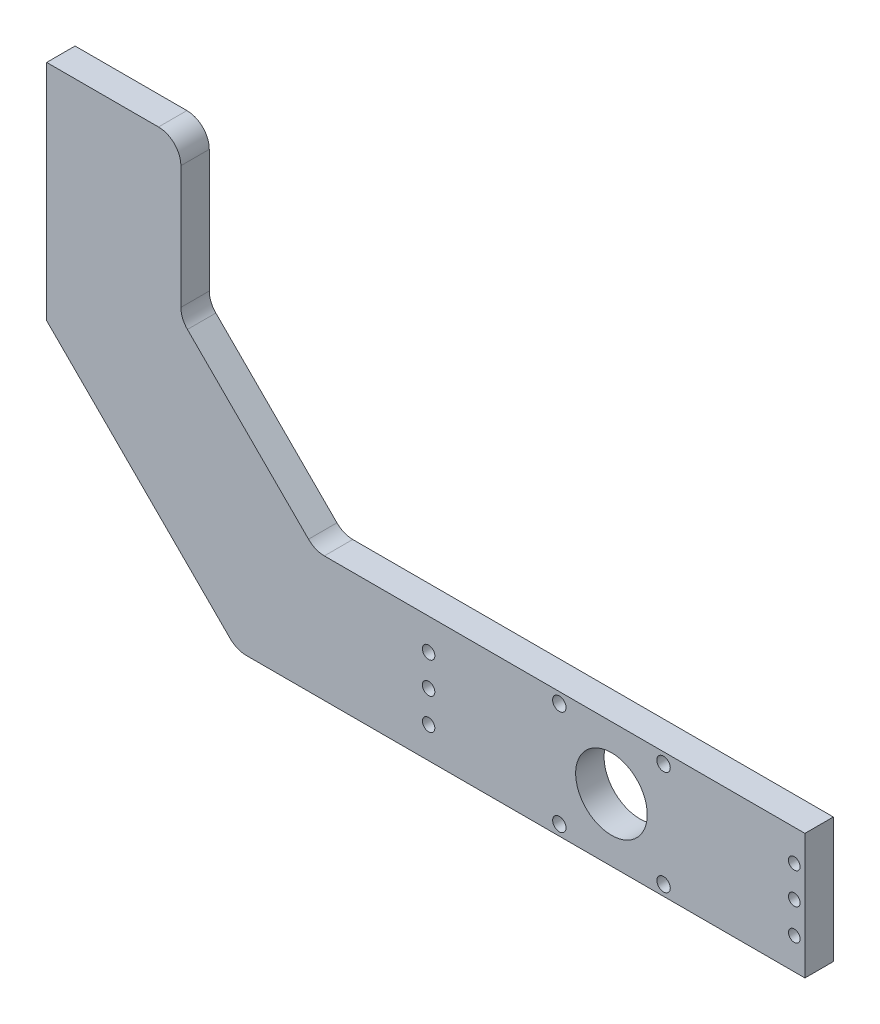
ISO-10303-21;
HEADER;
FILE_DESCRIPTION(('STEP AP214'),'2;1');
FILE_NAME('part.step','',(''),(''),'','','');
FILE_SCHEMA(('AUTOMOTIVE_DESIGN { 1 0 10303 214 1 1 1 1 }'));
ENDSEC;
DATA;
#1=APPLICATION_CONTEXT('core data for automotive mechanical design processes');
#2=APPLICATION_PROTOCOL_DEFINITION('international standard','automotive_design',2000,#1);
#3=PRODUCT_CONTEXT('',#1,'mechanical');
#4=PRODUCT('Part','Part','',(#3));
#5=PRODUCT_RELATED_PRODUCT_CATEGORY('part','',(#4));
#6=PRODUCT_DEFINITION_FORMATION('','',#4);
#7=PRODUCT_DEFINITION_CONTEXT('part definition',#1,'design');
#8=PRODUCT_DEFINITION('design','',#6,#7);
#9=PRODUCT_DEFINITION_SHAPE('','',#8);
#10=(LENGTH_UNIT() NAMED_UNIT(*) SI_UNIT(.MILLI.,.METRE.));
#11=(NAMED_UNIT(*) PLANE_ANGLE_UNIT() SI_UNIT($,.RADIAN.));
#12=(NAMED_UNIT(*) SI_UNIT($,.STERADIAN.) SOLID_ANGLE_UNIT());
#13=UNCERTAINTY_MEASURE_WITH_UNIT(LENGTH_MEASURE(1.E-05),#10,'distance_accuracy_value','');
#14=(GEOMETRIC_REPRESENTATION_CONTEXT(3) GLOBAL_UNCERTAINTY_ASSIGNED_CONTEXT((#13)) GLOBAL_UNIT_ASSIGNED_CONTEXT((#10,
#11,#12)) REPRESENTATION_CONTEXT('',''));
#15=CARTESIAN_POINT('',(0.,0.,0.));
#16=DIRECTION('',(0.,0.,1.));
#17=DIRECTION('',(1.,0.,0.));
#18=AXIS2_PLACEMENT_3D('',#15,#16,#17);
#19=CARTESIAN_POINT('',(18.4222454265081,-36.0239718131346,12.7));
#20=DIRECTION('',(0.,-1.,0.));
#21=DIRECTION('',(1.,0.,0.));
#22=AXIS2_PLACEMENT_3D('',#19,#20,#21);
#23=PLANE('',#22);
#24=DIRECTION('',(-1.,0.,0.));
#25=VECTOR('',#24,1.);
#26=CARTESIAN_POINT('',(18.4222454265081,-36.0239718131346,0.));
#27=LINE('',#26,#25);
#28=CARTESIAN_POINT('',(224.714042280299,-36.0239718131344,0.));
#29=VERTEX_POINT('',#28);
#30=CARTESIAN_POINT('',(9.85617790402943,-36.0239718131346,0.));
#31=VERTEX_POINT('',#30);
#32=EDGE_CURVE('E161',#29,#31,#27,.T.);
#33=ORIENTED_EDGE('',*,*,#32,.T.);
#34=DIRECTION('',(0.,0.,-1.));
#35=VECTOR('',#34,1.);
#36=CARTESIAN_POINT('',(9.85617790402943,-36.0239718131346,12.7));
#37=LINE('',#36,#35);
#38=CARTESIAN_POINT('',(9.85617790402943,-36.0239718131346,12.7));
#39=VERTEX_POINT('',#38);
#40=EDGE_CURVE('E196',#31,#39,#37,.F.);
#41=ORIENTED_EDGE('',*,*,#40,.T.);
#42=DIRECTION('',(-1.,0.,0.));
#43=VECTOR('',#42,1.);
#44=CARTESIAN_POINT('',(18.4222454265081,-36.0239718131346,12.7));
#45=LINE('',#44,#43);
#46=CARTESIAN_POINT('',(224.714042280299,-36.0239718131344,12.7));
#47=VERTEX_POINT('',#46);
#48=EDGE_CURVE('E178',#47,#39,#45,.T.);
#49=ORIENTED_EDGE('',*,*,#48,.F.);
#50=DIRECTION('',(0.,0.,-1.));
#51=VECTOR('',#50,1.);
#52=CARTESIAN_POINT('',(224.714042280299,-36.0239718131344,12.7));
#53=LINE('',#52,#51);
#54=EDGE_CURVE('E160',#47,#29,#53,.T.);
#55=ORIENTED_EDGE('',*,*,#54,.T.);
#56=EDGE_LOOP('',(#33,#41,#49,#55));
#57=FACE_BOUND('',#56,.T.);
#58=ADVANCED_FACE('F34',(#57),#23,.F.);
#59=CARTESIAN_POINT('',(201.815385528004,-232.125315060842,12.7));
#60=DIRECTION('',(-0.707106781186551,-0.707106781186544,0.));
#61=DIRECTION('',(0.707106781186544,-0.707106781186551,0.));
#62=AXIS2_PLACEMENT_3D('',#59,#60,#61);
#63=PLANE('',#62);
#64=DIRECTION('',(-0.707106781186544,0.707106781186551,0.));
#65=VECTOR('',#64,1.);
#66=CARTESIAN_POINT('',(201.815385528004,-232.125315060842,0.));
#67=LINE('',#66,#65);
#68=CARTESIAN_POINT('',(2.78511009216389,-33.095039625,0.));
#69=VERTEX_POINT('',#68);
#70=CARTESIAN_POINT('',(-51.3570255315668,21.0470959987312,0.));
#71=VERTEX_POINT('',#70);
#72=EDGE_CURVE('E164',#69,#71,#67,.T.);
#73=ORIENTED_EDGE('',*,*,#72,.T.);
#74=DIRECTION('',(0.,0.,-1.));
#75=VECTOR('',#74,1.);
#76=CARTESIAN_POINT('',(-51.3570255315667,21.0470959987312,12.7));
#77=LINE('',#76,#75);
#78=CARTESIAN_POINT('',(-51.3570255315668,21.0470959987312,12.7));
#79=VERTEX_POINT('',#78);
#80=EDGE_CURVE('E194',#71,#79,#77,.F.);
#81=ORIENTED_EDGE('',*,*,#80,.T.);
#82=DIRECTION('',(-0.707106781186544,0.707106781186551,0.));
#83=VECTOR('',#82,1.);
#84=CARTESIAN_POINT('',(201.815385528004,-232.125315060842,12.7));
#85=LINE('',#84,#83);
#86=CARTESIAN_POINT('',(2.78511009216389,-33.095039625,12.7));
#87=VERTEX_POINT('',#86);
#88=EDGE_CURVE('E228',#87,#79,#85,.T.);
#89=ORIENTED_EDGE('',*,*,#88,.F.);
#90=DIRECTION('',(0.,0.,-1.));
#91=VECTOR('',#90,1.);
#92=CARTESIAN_POINT('',(2.78511009216391,-33.095039625,0.));
#93=LINE('',#92,#91);
#94=EDGE_CURVE('E191',#87,#69,#93,.T.);
#95=ORIENTED_EDGE('',*,*,#94,.T.);
#96=EDGE_LOOP('',(#73,#81,#89,#95));
#97=FACE_BOUND('',#96,.T.);
#98=ADVANCED_FACE('F231',(#97),#63,.F.);
#99=CARTESIAN_POINT('',(-54.2859577197013,-415.518455162336,12.7));
#100=DIRECTION('',(1.,0.,0.));
#101=DIRECTION('',(0.,1.,0.));
#102=AXIS2_PLACEMENT_3D('',#99,#100,#101);
#103=PLANE('',#102);
#104=DIRECTION('',(0.,-1.,0.));
#105=VECTOR('',#104,1.);
#106=CARTESIAN_POINT('',(-54.2859577197013,-415.518455162336,12.7));
#107=LINE('',#106,#105);
#108=CARTESIAN_POINT('',(-54.2859577197012,82.9760281868658,12.7));
#109=VERTEX_POINT('',#108);
#110=CARTESIAN_POINT('',(-54.2859577197012,28.1181638105967,12.7));
#111=VERTEX_POINT('',#110);
#112=EDGE_CURVE('E155',#109,#111,#107,.T.);
#113=ORIENTED_EDGE('',*,*,#112,.T.);
#114=DIRECTION('',(0.,0.,-1.));
#115=VECTOR('',#114,1.);
#116=CARTESIAN_POINT('',(-54.2859577197012,28.1181638105967,12.7));
#117=LINE('',#116,#115);
#118=CARTESIAN_POINT('',(-54.2859577197012,28.1181638105967,0.));
#119=VERTEX_POINT('',#118);
#120=EDGE_CURVE('E188',#111,#119,#117,.T.);
#121=ORIENTED_EDGE('',*,*,#120,.T.);
#122=DIRECTION('',(0.,-1.,0.));
#123=VECTOR('',#122,1.);
#124=CARTESIAN_POINT('',(-54.2859577197013,-415.518455162336,0.));
#125=LINE('',#124,#123);
#126=CARTESIAN_POINT('',(-54.2859577197012,82.9760281868658,0.));
#127=VERTEX_POINT('',#126);
#128=EDGE_CURVE('E168',#127,#119,#125,.T.);
#129=ORIENTED_EDGE('',*,*,#128,.F.);
#130=DIRECTION('',(0.,0.,-1.));
#131=VECTOR('',#130,1.);
#132=CARTESIAN_POINT('',(-54.2859577197012,82.9760281868658,12.7));
#133=LINE('',#132,#131);
#134=EDGE_CURVE('E186',#127,#109,#133,.F.);
#135=ORIENTED_EDGE('',*,*,#134,.T.);
#136=EDGE_LOOP('',(#113,#121,#129,#135));
#137=FACE_BOUND('',#136,.T.);
#138=ADVANCED_FACE('F375',(#137),#103,.T.);
#139=CARTESIAN_POINT('',(18.4222454265051,92.9760281868663,12.7));
#140=DIRECTION('',(0.,-1.,0.));
#141=DIRECTION('',(1.,0.,0.));
#142=AXIS2_PLACEMENT_3D('',#139,#140,#141);
#143=PLANE('',#142);
#144=DIRECTION('',(-1.,0.,0.));
#145=VECTOR('',#144,1.);
#146=CARTESIAN_POINT('',(18.4222454265051,92.9760281868663,12.7));
#147=LINE('',#146,#145);
#148=CARTESIAN_POINT('',(-64.2859577197013,92.9760281868658,12.7));
#149=VERTEX_POINT('',#148);
#150=CARTESIAN_POINT('',(-114.285957719702,92.9760281868655,12.7));
#151=VERTEX_POINT('',#150);
#152=EDGE_CURVE('E149',#149,#151,#147,.T.);
#153=ORIENTED_EDGE('',*,*,#152,.F.);
#154=DIRECTION('',(0.,0.,-1.));
#155=VECTOR('',#154,1.);
#156=CARTESIAN_POINT('',(-64.2859577197013,92.9760281868658,0.));
#157=LINE('',#156,#155);
#158=CARTESIAN_POINT('',(-64.2859577197013,92.9760281868658,0.));
#159=VERTEX_POINT('',#158);
#160=EDGE_CURVE('E207',#149,#159,#157,.T.);
#161=ORIENTED_EDGE('',*,*,#160,.T.);
#162=DIRECTION('',(-1.,0.,0.));
#163=VECTOR('',#162,1.);
#164=CARTESIAN_POINT('',(18.4222454265051,92.9760281868663,0.));
#165=LINE('',#164,#163);
#166=CARTESIAN_POINT('',(-114.285957719702,92.9760281868655,0.));
#167=VERTEX_POINT('',#166);
#168=EDGE_CURVE('E171',#159,#167,#165,.T.);
#169=ORIENTED_EDGE('',*,*,#168,.T.);
#170=DIRECTION('',(0.,0.,-1.));
#171=VECTOR('',#170,1.);
#172=CARTESIAN_POINT('',(-114.285957719702,92.9760281868655,12.7));
#173=LINE('',#172,#171);
#174=EDGE_CURVE('E184',#151,#167,#173,.T.);
#175=ORIENTED_EDGE('',*,*,#174,.F.);
#176=EDGE_LOOP('',(#153,#161,#169,#175));
#177=FACE_BOUND('',#176,.T.);
#178=ADVANCED_FACE('F404',(#177),#143,.F.);
#179=CARTESIAN_POINT('',(-114.285957719701,-415.518455162336,12.7));
#180=DIRECTION('',(1.,0.,0.));
#181=DIRECTION('',(0.,1.,0.));
#182=AXIS2_PLACEMENT_3D('',#179,#180,#181);
#183=PLANE('',#182);
#184=CARTESIAN_POINT('',(-114.285957719702,17.976028186866,4.76500000000001));
#185=DIRECTION('',(-1.,0.,0.));
#186=DIRECTION('',(0.,-1.,0.));
#187=AXIS2_PLACEMENT_3D('',#184,#185,#186);
#188=CIRCLE('',#187,2.5);
#189=CARTESIAN_POINT('',(-114.285957719702,15.476028186866,4.76500000000001));
#190=VERTEX_POINT('',#189);
#191=EDGE_CURVE('E279',#190,#190,#188,.T.);
#192=ORIENTED_EDGE('',*,*,#191,.F.);
#193=EDGE_LOOP('',(#192));
#194=FACE_BOUND('',#193,.T.);
#195=CARTESIAN_POINT('',(-114.285957719702,42.9760281868658,4.76500000000001));
#196=DIRECTION('',(-1.,0.,0.));
#197=DIRECTION('',(0.,-1.,0.));
#198=AXIS2_PLACEMENT_3D('',#195,#196,#197);
#199=CIRCLE('',#198,2.5);
#200=CARTESIAN_POINT('',(-114.285957719702,40.4760281868658,4.76500000000001));
#201=VERTEX_POINT('',#200);
#202=EDGE_CURVE('E273',#201,#201,#199,.T.);
#203=ORIENTED_EDGE('',*,*,#202,.F.);
#204=EDGE_LOOP('',(#203));
#205=FACE_BOUND('',#204,.T.);
#206=CARTESIAN_POINT('',(-114.285957719702,67.9760281868655,4.765));
#207=DIRECTION('',(-1.,0.,0.));
#208=DIRECTION('',(0.,-1.,0.));
#209=AXIS2_PLACEMENT_3D('',#206,#207,#208);
#210=CIRCLE('',#209,2.5);
#211=CARTESIAN_POINT('',(-114.285957719702,65.4760281868655,4.765));
#212=VERTEX_POINT('',#211);
#213=EDGE_CURVE('E267',#212,#212,#210,.T.);
#214=ORIENTED_EDGE('',*,*,#213,.F.);
#215=EDGE_LOOP('',(#214));
#216=FACE_BOUND('',#215,.T.);
#217=DIRECTION('',(0.,-1.,0.));
#218=VECTOR('',#217,1.);
#219=CARTESIAN_POINT('',(-114.285957719701,-415.518455162336,0.));
#220=LINE('',#219,#218);
#221=CARTESIAN_POINT('',(-114.285957719702,-7.02397181313455,0.));
#222=VERTEX_POINT('',#221);
#223=EDGE_CURVE('E143',#167,#222,#220,.T.);
#224=ORIENTED_EDGE('',*,*,#223,.T.);
#225=DIRECTION('',(0.,0.,1.));
#226=VECTOR('',#225,1.);
#227=CARTESIAN_POINT('',(-114.285957719702,-7.02397181313451,-0.000999999999999265));
#228=LINE('',#227,#226);
#229=CARTESIAN_POINT('',(-114.285957719702,-7.02397181313451,12.7));
#230=VERTEX_POINT('',#229);
#231=EDGE_CURVE('E128',#222,#230,#228,.T.);
#232=ORIENTED_EDGE('',*,*,#231,.T.);
#233=DIRECTION('',(0.,-1.,0.));
#234=VECTOR('',#233,1.);
#235=CARTESIAN_POINT('',(-114.285957719701,-415.518455162336,12.7));
#236=LINE('',#235,#234);
#237=EDGE_CURVE('E141',#151,#230,#236,.T.);
#238=ORIENTED_EDGE('',*,*,#237,.F.);
#239=ORIENTED_EDGE('',*,*,#174,.T.);
#240=EDGE_LOOP('',(#224,#232,#238,#239));
#241=FACE_BOUND('',#240,.T.);
#242=ADVANCED_FACE('F139',(#194,#205,#216,#241),#183,.F.);
#243=CARTESIAN_POINT('',(18.4222454265082,-92.0239718131345,12.7));
#244=DIRECTION('',(0.,1.,0.));
#245=DIRECTION('',(0.,0.,1.));
#246=AXIS2_PLACEMENT_3D('',#243,#244,#245);
#247=PLANE('',#246);
#248=DIRECTION('',(1.,0.,0.));
#249=VECTOR('',#248,1.);
#250=CARTESIAN_POINT('',(18.4222454265082,-92.0239718131345,12.7));
#251=LINE('',#250,#249);
#252=CARTESIAN_POINT('',(-25.1438220959715,-92.0239718131345,12.7));
#253=VERTEX_POINT('',#252);
#254=CARTESIAN_POINT('',(224.714042280298,-92.0239718131345,12.7));
#255=VERTEX_POINT('',#254);
#256=EDGE_CURVE('E151',#253,#255,#251,.T.);
#257=ORIENTED_EDGE('',*,*,#256,.F.);
#258=DIRECTION('',(0.,0.,1.));
#259=VECTOR('',#258,1.);
#260=CARTESIAN_POINT('',(-25.1438220959715,-92.0239718131345,12.7));
#261=LINE('',#260,#259);
#262=CARTESIAN_POINT('',(-25.1438220959715,-92.0239718131345,0.));
#263=VERTEX_POINT('',#262);
#264=EDGE_CURVE('E57',#253,#263,#261,.F.);
#265=ORIENTED_EDGE('',*,*,#264,.T.);
#266=DIRECTION('',(1.,0.,0.));
#267=VECTOR('',#266,1.);
#268=CARTESIAN_POINT('',(18.4222454265082,-92.0239718131345,0.));
#269=LINE('',#268,#267);
#270=CARTESIAN_POINT('',(224.714042280298,-92.0239718131345,0.));
#271=VERTEX_POINT('',#270);
#272=EDGE_CURVE('E174',#263,#271,#269,.T.);
#273=ORIENTED_EDGE('',*,*,#272,.T.);
#274=DIRECTION('',(0.,0.,-1.));
#275=VECTOR('',#274,1.);
#276=CARTESIAN_POINT('',(224.714042280298,-92.0239718131345,12.7));
#277=LINE('',#276,#275);
#278=EDGE_CURVE('E181',#255,#271,#277,.T.);
#279=ORIENTED_EDGE('',*,*,#278,.F.);
#280=EDGE_LOOP('',(#257,#265,#273,#279));
#281=FACE_BOUND('',#280,.T.);
#282=ADVANCED_FACE('F392',(#281),#247,.F.);
#283=CARTESIAN_POINT('',(224.714042280299,-415.518455162336,12.7));
#284=DIRECTION('',(-1.,0.,0.));
#285=DIRECTION('',(0.,0.,1.));
#286=AXIS2_PLACEMENT_3D('',#283,#284,#285);
#287=PLANE('',#286);
#288=DIRECTION('',(0.,1.,0.));
#289=VECTOR('',#288,1.);
#290=CARTESIAN_POINT('',(224.714042280299,-415.518455162336,0.));
#291=LINE('',#290,#289);
#292=EDGE_CURVE('E176',#271,#29,#291,.T.);
#293=ORIENTED_EDGE('',*,*,#292,.T.);
#294=ORIENTED_EDGE('',*,*,#54,.F.);
#295=DIRECTION('',(0.,1.,0.));
#296=VECTOR('',#295,1.);
#297=CARTESIAN_POINT('',(224.714042280299,-415.518455162336,12.7));
#298=LINE('',#297,#296);
#299=EDGE_CURVE('E153',#255,#47,#298,.T.);
#300=ORIENTED_EDGE('',*,*,#299,.F.);
#301=ORIENTED_EDGE('',*,*,#278,.T.);
#302=EDGE_LOOP('',(#293,#294,#300,#301));
#303=FACE_BOUND('',#302,.T.);
#304=ADVANCED_FACE('F326',(#303),#287,.F.);
#305=CARTESIAN_POINT('',(18.4222454265082,-415.518455162336,12.7));
#306=DIRECTION('',(0.,0.,1.));
#307=DIRECTION('',(1.,0.,0.));
#308=AXIS2_PLACEMENT_3D('',#305,#306,#307);
#309=PLANE('',#308);
#310=CARTESIAN_POINT('',(219.954042280298,-78.0239718131345,12.7));
#311=DIRECTION('',(0.,0.,1.));
#312=DIRECTION('',(1.,0.,0.));
#313=AXIS2_PLACEMENT_3D('',#310,#311,#312);
#314=CIRCLE('',#313,2.59999999999999);
#315=CARTESIAN_POINT('',(222.554042280298,-78.0239718131345,12.7));
#316=VERTEX_POINT('',#315);
#317=EDGE_CURVE('E317',#316,#316,#314,.T.);
#318=ORIENTED_EDGE('',*,*,#317,.F.);
#319=EDGE_LOOP('',(#318));
#320=FACE_BOUND('',#319,.T.);
#321=CARTESIAN_POINT('',(219.954042280298,-64.0239718131345,12.7));
#322=DIRECTION('',(0.,0.,1.));
#323=DIRECTION('',(1.,0.,0.));
#324=AXIS2_PLACEMENT_3D('',#321,#322,#323);
#325=CIRCLE('',#324,2.59999999999999);
#326=CARTESIAN_POINT('',(222.554042280298,-64.0239718131345,12.7));
#327=VERTEX_POINT('',#326);
#328=EDGE_CURVE('E311',#327,#327,#325,.T.);
#329=ORIENTED_EDGE('',*,*,#328,.F.);
#330=EDGE_LOOP('',(#329));
#331=FACE_BOUND('',#330,.T.);
#332=CARTESIAN_POINT('',(219.954042280298,-50.0239718131344,12.7));
#333=DIRECTION('',(0.,0.,1.));
#334=DIRECTION('',(1.,0.,0.));
#335=AXIS2_PLACEMENT_3D('',#332,#333,#334);
#336=CIRCLE('',#335,2.59999999999999);
#337=CARTESIAN_POINT('',(222.554042280298,-50.0239718131344,12.7));
#338=VERTEX_POINT('',#337);
#339=EDGE_CURVE('E305',#338,#338,#336,.T.);
#340=ORIENTED_EDGE('',*,*,#339,.F.);
#341=EDGE_LOOP('',(#340));
#342=FACE_BOUND('',#341,.T.);
#343=CARTESIAN_POINT('',(56.4740422802985,-78.0239718131356,12.7));
#344=DIRECTION('',(0.,0.,1.));
#345=DIRECTION('',(1.,0.,0.));
#346=AXIS2_PLACEMENT_3D('',#343,#344,#345);
#347=CIRCLE('',#346,2.78);
#348=CARTESIAN_POINT('',(59.2540422802984,-78.0239718131356,12.7));
#349=VERTEX_POINT('',#348);
#350=EDGE_CURVE('E299',#349,#349,#347,.T.);
#351=ORIENTED_EDGE('',*,*,#350,.F.);
#352=EDGE_LOOP('',(#351));
#353=FACE_BOUND('',#352,.T.);
#354=CARTESIAN_POINT('',(56.4740422802985,-64.0239718131355,12.7));
#355=DIRECTION('',(0.,0.,1.));
#356=DIRECTION('',(1.,0.,0.));
#357=AXIS2_PLACEMENT_3D('',#354,#355,#356);
#358=CIRCLE('',#357,2.78);
#359=CARTESIAN_POINT('',(59.2540422802984,-64.0239718131355,12.7));
#360=VERTEX_POINT('',#359);
#361=EDGE_CURVE('E293',#360,#360,#358,.T.);
#362=ORIENTED_EDGE('',*,*,#361,.F.);
#363=EDGE_LOOP('',(#362));
#364=FACE_BOUND('',#363,.T.);
#365=CARTESIAN_POINT('',(56.4740422802984,-50.0239718131353,12.7));
#366=DIRECTION('',(0.,0.,1.));
#367=DIRECTION('',(1.,0.,0.));
#368=AXIS2_PLACEMENT_3D('',#365,#366,#367);
#369=CIRCLE('',#368,2.78);
#370=CARTESIAN_POINT('',(59.2540422802984,-50.0239718131353,12.7));
#371=VERTEX_POINT('',#370);
#372=EDGE_CURVE('E287',#371,#371,#369,.T.);
#373=ORIENTED_EDGE('',*,*,#372,.F.);
#374=EDGE_LOOP('',(#373));
#375=FACE_BOUND('',#374,.T.);
#376=DIRECTION('',(-0.707106781186544,0.707106781186551,0.));
#377=VECTOR('',#376,1.);
#378=CARTESIAN_POINT('',(-29.2859577197025,-92.0239718131345,12.7));
#379=LINE('',#378,#377);
#380=CARTESIAN_POINT('',(-32.214889907837,-89.0950396249999,12.7));
#381=VERTEX_POINT('',#380);
#382=EDGE_CURVE('E124',#381,#230,#379,.T.);
#383=ORIENTED_EDGE('',*,*,#382,.F.);
#384=CARTESIAN_POINT('',(-25.1438220959715,-82.0239718131345,12.7));
#385=DIRECTION('',(0.,0.,1.));
#386=DIRECTION('',(1.,0.,0.));
#387=AXIS2_PLACEMENT_3D('',#384,#385,#386);
#388=CIRCLE('',#387,10.);
#389=EDGE_CURVE('E201',#381,#253,#388,.T.);
#390=ORIENTED_EDGE('',*,*,#389,.T.);
#391=ORIENTED_EDGE('',*,*,#256,.T.);
#392=ORIENTED_EDGE('',*,*,#299,.T.);
#393=ORIENTED_EDGE('',*,*,#48,.T.);
#394=CARTESIAN_POINT('',(9.85617790402943,-26.0239718131345,12.7));
#395=DIRECTION('',(0.,0.,1.));
#396=DIRECTION('',(1.,0.,0.));
#397=AXIS2_PLACEMENT_3D('',#394,#395,#396);
#398=CIRCLE('',#397,10.);
#399=EDGE_CURVE('E11',#39,#87,#398,.F.);
#400=ORIENTED_EDGE('',*,*,#399,.T.);
#401=ORIENTED_EDGE('',*,*,#88,.T.);
#402=CARTESIAN_POINT('',(-44.2859577197012,28.1181638105967,12.7));
#403=DIRECTION('',(0.,0.,1.));
#404=DIRECTION('',(1.,0.,0.));
#405=AXIS2_PLACEMENT_3D('',#402,#403,#404);
#406=CIRCLE('',#405,10.);
#407=EDGE_CURVE('E211',#79,#111,#406,.F.);
#408=ORIENTED_EDGE('',*,*,#407,.T.);
#409=ORIENTED_EDGE('',*,*,#112,.F.);
#410=CARTESIAN_POINT('',(-64.2859577197012,82.9760281868658,12.7));
#411=DIRECTION('',(0.,0.,1.));
#412=DIRECTION('',(1.,0.,0.));
#413=AXIS2_PLACEMENT_3D('',#410,#411,#412);
#414=CIRCLE('',#413,10.);
#415=EDGE_CURVE('E199',#109,#149,#414,.T.);
#416=ORIENTED_EDGE('',*,*,#415,.T.);
#417=ORIENTED_EDGE('',*,*,#152,.T.);
#418=ORIENTED_EDGE('',*,*,#237,.T.);
#419=EDGE_LOOP('',(#383,#390,#391,#392,#393,#400,#401,#408,#409,#416,#417,#418));
#420=FACE_BOUND('',#419,.T.);
#421=CARTESIAN_POINT('',(114.914042280298,-87.3239718131345,12.7));
#422=DIRECTION('',(0.,0.,1.));
#423=DIRECTION('',(-1.,0.,0.));
#424=AXIS2_PLACEMENT_3D('',#421,#422,#423);
#425=CIRCLE('',#424,3.00000000000001);
#426=CARTESIAN_POINT('',(111.914042280298,-87.3239718131345,12.7));
#427=VERTEX_POINT('',#426);
#428=EDGE_CURVE('E263',#427,#427,#425,.T.);
#429=ORIENTED_EDGE('',*,*,#428,.F.);
#430=EDGE_LOOP('',(#429));
#431=FACE_BOUND('',#430,.T.);
#432=CARTESIAN_POINT('',(161.514042280298,-87.3239718131345,12.7));
#433=DIRECTION('',(0.,0.,1.));
#434=DIRECTION('',(1.,0.,0.));
#435=AXIS2_PLACEMENT_3D('',#432,#433,#434);
#436=CIRCLE('',#435,2.99999999999999);
#437=CARTESIAN_POINT('',(164.514042280298,-87.3239718131345,12.7));
#438=VERTEX_POINT('',#437);
#439=EDGE_CURVE('E257',#438,#438,#436,.T.);
#440=ORIENTED_EDGE('',*,*,#439,.F.);
#441=EDGE_LOOP('',(#440));
#442=FACE_BOUND('',#441,.T.);
#443=CARTESIAN_POINT('',(161.514042280298,-40.7239718131345,12.7));
#444=DIRECTION('',(0.,0.,1.));
#445=DIRECTION('',(-1.,0.,0.));
#446=AXIS2_PLACEMENT_3D('',#443,#444,#445);
#447=CIRCLE('',#446,2.99999999999999);
#448=CARTESIAN_POINT('',(158.514042280298,-40.7239718131345,12.7));
#449=VERTEX_POINT('',#448);
#450=EDGE_CURVE('E251',#449,#449,#447,.T.);
#451=ORIENTED_EDGE('',*,*,#450,.F.);
#452=EDGE_LOOP('',(#451));
#453=FACE_BOUND('',#452,.T.);
#454=CARTESIAN_POINT('',(114.914042280298,-40.7239718131345,12.7));
#455=DIRECTION('',(0.,0.,1.));
#456=DIRECTION('',(1.,0.,0.));
#457=AXIS2_PLACEMENT_3D('',#454,#455,#456);
#458=CIRCLE('',#457,3.00000000000001);
#459=CARTESIAN_POINT('',(117.914042280298,-40.7239718131345,12.7));
#460=VERTEX_POINT('',#459);
#461=EDGE_CURVE('E245',#460,#460,#458,.T.);
#462=ORIENTED_EDGE('',*,*,#461,.F.);
#463=EDGE_LOOP('',(#462));
#464=FACE_BOUND('',#463,.T.);
#465=CARTESIAN_POINT('',(138.214042280298,-64.0239718131345,12.7));
#466=DIRECTION('',(0.,0.,1.));
#467=DIRECTION('',(1.,0.,0.));
#468=AXIS2_PLACEMENT_3D('',#465,#466,#467);
#469=CIRCLE('',#468,16.);
#470=CARTESIAN_POINT('',(154.214042280298,-64.0239718131345,12.7));
#471=VERTEX_POINT('',#470);
#472=EDGE_CURVE('E239',#471,#471,#469,.T.);
#473=ORIENTED_EDGE('',*,*,#472,.F.);
#474=EDGE_LOOP('',(#473));
#475=FACE_BOUND('',#474,.T.);
#476=ADVANCED_FACE('F146',(#320,#331,#342,#353,#364,#375,#420,#431,#442,#453,#464,#475),#309,.T.);
#477=CARTESIAN_POINT('',(18.4222454265082,-415.518455162336,0.));
#478=DIRECTION('',(0.,0.,1.));
#479=DIRECTION('',(1.,0.,0.));
#480=AXIS2_PLACEMENT_3D('',#477,#478,#479);
#481=PLANE('',#480);
#482=CARTESIAN_POINT('',(219.954042280298,-78.0239718131345,0.));
#483=DIRECTION('',(0.,0.,1.));
#484=DIRECTION('',(1.,0.,0.));
#485=AXIS2_PLACEMENT_3D('',#482,#483,#484);
#486=CIRCLE('',#485,2.59999999999999);
#487=CARTESIAN_POINT('',(222.554042280298,-78.0239718131345,0.));
#488=VERTEX_POINT('',#487);
#489=EDGE_CURVE('E314',#488,#488,#486,.F.);
#490=ORIENTED_EDGE('',*,*,#489,.F.);
#491=EDGE_LOOP('',(#490));
#492=FACE_BOUND('',#491,.T.);
#493=CARTESIAN_POINT('',(219.954042280298,-64.0239718131345,0.));
#494=DIRECTION('',(0.,0.,1.));
#495=DIRECTION('',(1.,0.,0.));
#496=AXIS2_PLACEMENT_3D('',#493,#494,#495);
#497=CIRCLE('',#496,2.59999999999999);
#498=CARTESIAN_POINT('',(222.554042280298,-64.0239718131345,0.));
#499=VERTEX_POINT('',#498);
#500=EDGE_CURVE('E308',#499,#499,#497,.F.);
#501=ORIENTED_EDGE('',*,*,#500,.F.);
#502=EDGE_LOOP('',(#501));
#503=FACE_BOUND('',#502,.T.);
#504=CARTESIAN_POINT('',(219.954042280298,-50.0239718131344,0.));
#505=DIRECTION('',(0.,0.,1.));
#506=DIRECTION('',(1.,0.,0.));
#507=AXIS2_PLACEMENT_3D('',#504,#505,#506);
#508=CIRCLE('',#507,2.59999999999999);
#509=CARTESIAN_POINT('',(222.554042280298,-50.0239718131344,0.));
#510=VERTEX_POINT('',#509);
#511=EDGE_CURVE('E302',#510,#510,#508,.F.);
#512=ORIENTED_EDGE('',*,*,#511,.F.);
#513=EDGE_LOOP('',(#512));
#514=FACE_BOUND('',#513,.T.);
#515=CARTESIAN_POINT('',(56.4740422802985,-78.0239718131356,0.));
#516=DIRECTION('',(0.,0.,1.));
#517=DIRECTION('',(1.,0.,0.));
#518=AXIS2_PLACEMENT_3D('',#515,#516,#517);
#519=CIRCLE('',#518,2.78);
#520=CARTESIAN_POINT('',(59.2540422802984,-78.0239718131356,0.));
#521=VERTEX_POINT('',#520);
#522=EDGE_CURVE('E296',#521,#521,#519,.F.);
#523=ORIENTED_EDGE('',*,*,#522,.F.);
#524=EDGE_LOOP('',(#523));
#525=FACE_BOUND('',#524,.T.);
#526=CARTESIAN_POINT('',(56.4740422802985,-64.0239718131355,0.));
#527=DIRECTION('',(0.,0.,1.));
#528=DIRECTION('',(1.,0.,0.));
#529=AXIS2_PLACEMENT_3D('',#526,#527,#528);
#530=CIRCLE('',#529,2.78);
#531=CARTESIAN_POINT('',(59.2540422802984,-64.0239718131355,0.));
#532=VERTEX_POINT('',#531);
#533=EDGE_CURVE('E290',#532,#532,#530,.F.);
#534=ORIENTED_EDGE('',*,*,#533,.F.);
#535=EDGE_LOOP('',(#534));
#536=FACE_BOUND('',#535,.T.);
#537=CARTESIAN_POINT('',(56.4740422802984,-50.0239718131353,0.));
#538=DIRECTION('',(0.,0.,1.));
#539=DIRECTION('',(1.,0.,0.));
#540=AXIS2_PLACEMENT_3D('',#537,#538,#539);
#541=CIRCLE('',#540,2.78);
#542=CARTESIAN_POINT('',(59.2540422802984,-50.0239718131353,0.));
#543=VERTEX_POINT('',#542);
#544=EDGE_CURVE('E134',#543,#543,#541,.F.);
#545=ORIENTED_EDGE('',*,*,#544,.F.);
#546=EDGE_LOOP('',(#545));
#547=FACE_BOUND('',#546,.T.);
#548=CARTESIAN_POINT('',(114.914042280298,-87.3239718131345,0.));
#549=DIRECTION('',(0.,0.,1.));
#550=DIRECTION('',(1.,0.,0.));
#551=AXIS2_PLACEMENT_3D('',#548,#549,#550);
#552=CIRCLE('',#551,3.00000000000001);
#553=CARTESIAN_POINT('',(117.914042280298,-87.3239718131345,0.));
#554=VERTEX_POINT('',#553);
#555=EDGE_CURVE('E260',#554,#554,#552,.F.);
#556=ORIENTED_EDGE('',*,*,#555,.F.);
#557=EDGE_LOOP('',(#556));
#558=FACE_BOUND('',#557,.T.);
#559=CARTESIAN_POINT('',(161.514042280298,-87.3239718131345,0.));
#560=DIRECTION('',(0.,0.,1.));
#561=DIRECTION('',(1.,0.,0.));
#562=AXIS2_PLACEMENT_3D('',#559,#560,#561);
#563=CIRCLE('',#562,2.99999999999999);
#564=CARTESIAN_POINT('',(164.514042280298,-87.3239718131345,0.));
#565=VERTEX_POINT('',#564);
#566=EDGE_CURVE('E254',#565,#565,#563,.F.);
#567=ORIENTED_EDGE('',*,*,#566,.F.);
#568=EDGE_LOOP('',(#567));
#569=FACE_BOUND('',#568,.T.);
#570=CARTESIAN_POINT('',(161.514042280298,-40.7239718131345,0.));
#571=DIRECTION('',(0.,0.,1.));
#572=DIRECTION('',(1.,0.,0.));
#573=AXIS2_PLACEMENT_3D('',#570,#571,#572);
#574=CIRCLE('',#573,2.99999999999999);
#575=CARTESIAN_POINT('',(164.514042280298,-40.7239718131345,0.));
#576=VERTEX_POINT('',#575);
#577=EDGE_CURVE('E248',#576,#576,#574,.F.);
#578=ORIENTED_EDGE('',*,*,#577,.F.);
#579=EDGE_LOOP('',(#578));
#580=FACE_BOUND('',#579,.T.);
#581=CARTESIAN_POINT('',(114.914042280298,-40.7239718131345,0.));
#582=DIRECTION('',(0.,0.,1.));
#583=DIRECTION('',(1.,0.,0.));
#584=AXIS2_PLACEMENT_3D('',#581,#582,#583);
#585=CIRCLE('',#584,3.00000000000001);
#586=CARTESIAN_POINT('',(117.914042280298,-40.7239718131345,0.));
#587=VERTEX_POINT('',#586);
#588=EDGE_CURVE('E242',#587,#587,#585,.F.);
#589=ORIENTED_EDGE('',*,*,#588,.F.);
#590=EDGE_LOOP('',(#589));
#591=FACE_BOUND('',#590,.T.);
#592=CARTESIAN_POINT('',(138.214042280298,-64.0239718131345,0.));
#593=DIRECTION('',(0.,0.,1.));
#594=DIRECTION('',(1.,0.,0.));
#595=AXIS2_PLACEMENT_3D('',#592,#593,#594);
#596=CIRCLE('',#595,16.);
#597=CARTESIAN_POINT('',(154.214042280298,-64.0239718131345,0.));
#598=VERTEX_POINT('',#597);
#599=EDGE_CURVE('E165',#598,#598,#596,.F.);
#600=ORIENTED_EDGE('',*,*,#599,.F.);
#601=EDGE_LOOP('',(#600));
#602=FACE_BOUND('',#601,.T.);
#603=ORIENTED_EDGE('',*,*,#272,.F.);
#604=CARTESIAN_POINT('',(-25.1438220959715,-82.0239718131345,0.));
#605=DIRECTION('',(0.,0.,1.));
#606=DIRECTION('',(1.,0.,0.));
#607=AXIS2_PLACEMENT_3D('',#604,#605,#606);
#608=CIRCLE('',#607,10.);
#609=CARTESIAN_POINT('',(-32.214889907837,-89.0950396249999,0.));
#610=VERTEX_POINT('',#609);
#611=EDGE_CURVE('E205',#263,#610,#608,.F.);
#612=ORIENTED_EDGE('',*,*,#611,.T.);
#613=DIRECTION('',(0.707106781186544,-0.707106781186551,0.));
#614=VECTOR('',#613,1.);
#615=CARTESIAN_POINT('',(-29.2859577197025,-92.0239718131345,0.));
#616=LINE('',#615,#614);
#617=EDGE_CURVE('E144',#222,#610,#616,.T.);
#618=ORIENTED_EDGE('',*,*,#617,.F.);
#619=ORIENTED_EDGE('',*,*,#223,.F.);
#620=ORIENTED_EDGE('',*,*,#168,.F.);
#621=CARTESIAN_POINT('',(-64.2859577197012,82.9760281868658,0.));
#622=DIRECTION('',(0.,0.,1.));
#623=DIRECTION('',(1.,0.,0.));
#624=AXIS2_PLACEMENT_3D('',#621,#622,#623);
#625=CIRCLE('',#624,10.);
#626=EDGE_CURVE('E49',#159,#127,#625,.F.);
#627=ORIENTED_EDGE('',*,*,#626,.T.);
#628=ORIENTED_EDGE('',*,*,#128,.T.);
#629=CARTESIAN_POINT('',(-44.2859577197012,28.1181638105967,0.));
#630=DIRECTION('',(0.,0.,1.));
#631=DIRECTION('',(1.,0.,0.));
#632=AXIS2_PLACEMENT_3D('',#629,#630,#631);
#633=CIRCLE('',#632,10.);
#634=EDGE_CURVE('E209',#119,#71,#633,.T.);
#635=ORIENTED_EDGE('',*,*,#634,.T.);
#636=ORIENTED_EDGE('',*,*,#72,.F.);
#637=CARTESIAN_POINT('',(9.85617790402943,-26.0239718131345,0.));
#638=DIRECTION('',(0.,0.,1.));
#639=DIRECTION('',(1.,0.,0.));
#640=AXIS2_PLACEMENT_3D('',#637,#638,#639);
#641=CIRCLE('',#640,10.);
#642=EDGE_CURVE('E42',#69,#31,#641,.T.);
#643=ORIENTED_EDGE('',*,*,#642,.T.);
#644=ORIENTED_EDGE('',*,*,#32,.F.);
#645=ORIENTED_EDGE('',*,*,#292,.F.);
#646=EDGE_LOOP('',(#603,#612,#618,#619,#620,#627,#628,#635,#636,#643,#644,#645));
#647=FACE_BOUND('',#646,.T.);
#648=ADVANCED_FACE('F215',(#492,#503,#514,#525,#536,#547,#558,#569,#580,#591,#602,#647),#481,.F.);
#649=CARTESIAN_POINT('',(138.214042280298,-64.0239718131345,-0.000999999999999265));
#650=DIRECTION('',(0.,0.,1.));
#651=DIRECTION('',(1.,0.,0.));
#652=AXIS2_PLACEMENT_3D('',#649,#650,#651);
#653=CYLINDRICAL_SURFACE('',#652,16.);
#654=ORIENTED_EDGE('',*,*,#472,.T.);
#655=EDGE_LOOP('',(#654));
#656=FACE_BOUND('',#655,.T.);
#657=ORIENTED_EDGE('',*,*,#599,.T.);
#658=EDGE_LOOP('',(#657));
#659=FACE_BOUND('',#658,.T.);
#660=ADVANCED_FACE('F347',(#656,#659),#653,.F.);
#661=CARTESIAN_POINT('',(114.914042280298,-40.7239718131345,-0.000999999999999265));
#662=DIRECTION('',(0.,0.,1.));
#663=DIRECTION('',(1.,0.,0.));
#664=AXIS2_PLACEMENT_3D('',#661,#662,#663);
#665=CYLINDRICAL_SURFACE('',#664,3.00000000000001);
#666=ORIENTED_EDGE('',*,*,#461,.T.);
#667=EDGE_LOOP('',(#666));
#668=FACE_BOUND('',#667,.T.);
#669=ORIENTED_EDGE('',*,*,#588,.T.);
#670=EDGE_LOOP('',(#669));
#671=FACE_BOUND('',#670,.T.);
#672=ADVANCED_FACE('F361',(#668,#671),#665,.F.);
#673=CARTESIAN_POINT('',(161.514042280298,-40.7239718131345,-0.000999999999999265));
#674=DIRECTION('',(0.,0.,1.));
#675=DIRECTION('',(1.,0.,0.));
#676=AXIS2_PLACEMENT_3D('',#673,#674,#675);
#677=CYLINDRICAL_SURFACE('',#676,2.99999999999999);
#678=ORIENTED_EDGE('',*,*,#450,.T.);
#679=EDGE_LOOP('',(#678));
#680=FACE_BOUND('',#679,.T.);
#681=ORIENTED_EDGE('',*,*,#577,.T.);
#682=EDGE_LOOP('',(#681));
#683=FACE_BOUND('',#682,.T.);
#684=ADVANCED_FACE('F367',(#680,#683),#677,.F.);
#685=CARTESIAN_POINT('',(161.514042280298,-87.3239718131345,-0.000999999999999265));
#686=DIRECTION('',(0.,0.,1.));
#687=DIRECTION('',(1.,0.,0.));
#688=AXIS2_PLACEMENT_3D('',#685,#686,#687);
#689=CYLINDRICAL_SURFACE('',#688,2.99999999999999);
#690=ORIENTED_EDGE('',*,*,#439,.T.);
#691=EDGE_LOOP('',(#690));
#692=FACE_BOUND('',#691,.T.);
#693=ORIENTED_EDGE('',*,*,#566,.T.);
#694=EDGE_LOOP('',(#693));
#695=FACE_BOUND('',#694,.T.);
#696=ADVANCED_FACE('F564',(#692,#695),#689,.F.);
#697=CARTESIAN_POINT('',(114.914042280298,-87.3239718131345,-0.000999999999999265));
#698=DIRECTION('',(0.,0.,1.));
#699=DIRECTION('',(1.,0.,0.));
#700=AXIS2_PLACEMENT_3D('',#697,#698,#699);
#701=CYLINDRICAL_SURFACE('',#700,3.00000000000001);
#702=ORIENTED_EDGE('',*,*,#428,.T.);
#703=EDGE_LOOP('',(#702));
#704=FACE_BOUND('',#703,.T.);
#705=ORIENTED_EDGE('',*,*,#555,.T.);
#706=EDGE_LOOP('',(#705));
#707=FACE_BOUND('',#706,.T.);
#708=ADVANCED_FACE('F560',(#704,#707),#701,.F.);
#709=CARTESIAN_POINT('',(-84.2859577197016,67.9760281868655,4.765));
#710=DIRECTION('',(-1.,0.,0.));
#711=DIRECTION('',(0.,-1.,0.));
#712=AXIS2_PLACEMENT_3D('',#709,#710,#711);
#713=CYLINDRICAL_SURFACE('',#712,2.5);
#714=CARTESIAN_POINT('',(-84.2859577197016,67.9760281868655,4.765));
#715=DIRECTION('',(-1.,0.,0.));
#716=DIRECTION('',(0.,-1.,0.));
#717=AXIS2_PLACEMENT_3D('',#714,#715,#716);
#718=CIRCLE('',#717,2.5);
#719=CARTESIAN_POINT('',(-84.2859577197016,65.4760281868655,4.765));
#720=VERTEX_POINT('',#719);
#721=EDGE_CURVE('E266',#720,#720,#718,.T.);
#722=ORIENTED_EDGE('',*,*,#721,.F.);
#723=EDGE_LOOP('',(#722));
#724=FACE_BOUND('',#723,.T.);
#725=ORIENTED_EDGE('',*,*,#213,.T.);
#726=EDGE_LOOP('',(#725));
#727=FACE_BOUND('',#726,.T.);
#728=ADVANCED_FACE('F556',(#724,#727),#713,.F.);
#729=CARTESIAN_POINT('',(-84.2859577197016,67.9760281868655,4.765));
#730=DIRECTION('',(-1.,0.,0.));
#731=DIRECTION('',(0.,-1.,0.));
#732=AXIS2_PLACEMENT_3D('',#729,#730,#731);
#733=PLANE('',#732);
#734=ORIENTED_EDGE('',*,*,#721,.T.);
#735=EDGE_LOOP('',(#734));
#736=FACE_BOUND('',#735,.T.);
#737=ADVANCED_FACE('F552',(#736),#733,.T.);
#738=CARTESIAN_POINT('',(-84.2859577197016,42.9760281868658,4.76500000000001));
#739=DIRECTION('',(-1.,0.,0.));
#740=DIRECTION('',(0.,-1.,0.));
#741=AXIS2_PLACEMENT_3D('',#738,#739,#740);
#742=CYLINDRICAL_SURFACE('',#741,2.5);
#743=CARTESIAN_POINT('',(-84.2859577197016,42.9760281868658,4.76500000000001));
#744=DIRECTION('',(-1.,0.,0.));
#745=DIRECTION('',(0.,-1.,0.));
#746=AXIS2_PLACEMENT_3D('',#743,#744,#745);
#747=CIRCLE('',#746,2.5);
#748=CARTESIAN_POINT('',(-84.2859577197016,40.4760281868658,4.76500000000001));
#749=VERTEX_POINT('',#748);
#750=EDGE_CURVE('E270',#749,#749,#747,.T.);
#751=ORIENTED_EDGE('',*,*,#750,.F.);
#752=EDGE_LOOP('',(#751));
#753=FACE_BOUND('',#752,.T.);
#754=ORIENTED_EDGE('',*,*,#202,.T.);
#755=EDGE_LOOP('',(#754));
#756=FACE_BOUND('',#755,.T.);
#757=ADVANCED_FACE('F548',(#753,#756),#742,.F.);
#758=CARTESIAN_POINT('',(-84.2859577197016,42.9760281868658,4.76500000000001));
#759=DIRECTION('',(-1.,0.,0.));
#760=DIRECTION('',(0.,-1.,0.));
#761=AXIS2_PLACEMENT_3D('',#758,#759,#760);
#762=PLANE('',#761);
#763=ORIENTED_EDGE('',*,*,#750,.T.);
#764=EDGE_LOOP('',(#763));
#765=FACE_BOUND('',#764,.T.);
#766=ADVANCED_FACE('F544',(#765),#762,.T.);
#767=CARTESIAN_POINT('',(-84.2859577197016,17.976028186866,4.76500000000001));
#768=DIRECTION('',(-1.,0.,0.));
#769=DIRECTION('',(0.,-1.,0.));
#770=AXIS2_PLACEMENT_3D('',#767,#768,#769);
#771=CYLINDRICAL_SURFACE('',#770,2.5);
#772=CARTESIAN_POINT('',(-84.2859577197016,17.976028186866,4.76500000000001));
#773=DIRECTION('',(-1.,0.,0.));
#774=DIRECTION('',(0.,-1.,0.));
#775=AXIS2_PLACEMENT_3D('',#772,#773,#774);
#776=CIRCLE('',#775,2.5);
#777=CARTESIAN_POINT('',(-84.2859577197016,15.476028186866,4.76500000000001));
#778=VERTEX_POINT('',#777);
#779=EDGE_CURVE('E276',#778,#778,#776,.T.);
#780=ORIENTED_EDGE('',*,*,#779,.F.);
#781=EDGE_LOOP('',(#780));
#782=FACE_BOUND('',#781,.T.);
#783=ORIENTED_EDGE('',*,*,#191,.T.);
#784=EDGE_LOOP('',(#783));
#785=FACE_BOUND('',#784,.T.);
#786=ADVANCED_FACE('F540',(#782,#785),#771,.F.);
#787=CARTESIAN_POINT('',(-84.2859577197016,17.976028186866,4.76500000000001));
#788=DIRECTION('',(-1.,0.,0.));
#789=DIRECTION('',(0.,-1.,0.));
#790=AXIS2_PLACEMENT_3D('',#787,#788,#789);
#791=PLANE('',#790);
#792=ORIENTED_EDGE('',*,*,#779,.T.);
#793=EDGE_LOOP('',(#792));
#794=FACE_BOUND('',#793,.T.);
#795=ADVANCED_FACE('F456',(#794),#791,.T.);
#796=CARTESIAN_POINT('',(-29.2859577197025,-92.0239718131345,-0.000999999999999265));
#797=DIRECTION('',(0.707106781186551,0.707106781186544,0.));
#798=DIRECTION('',(-0.707106781186544,0.707106781186551,0.));
#799=AXIS2_PLACEMENT_3D('',#796,#797,#798);
#800=PLANE('',#799);
#801=ORIENTED_EDGE('',*,*,#617,.T.);
#802=DIRECTION('',(0.,0.,1.));
#803=VECTOR('',#802,1.);
#804=CARTESIAN_POINT('',(-32.214889907837,-89.0950396249999,-0.000999999999999265));
#805=LINE('',#804,#803);
#806=EDGE_CURVE('E131',#610,#381,#805,.T.);
#807=ORIENTED_EDGE('',*,*,#806,.T.);
#808=ORIENTED_EDGE('',*,*,#382,.T.);
#809=ORIENTED_EDGE('',*,*,#231,.F.);
#810=EDGE_LOOP('',(#801,#807,#808,#809));
#811=FACE_BOUND('',#810,.T.);
#812=ADVANCED_FACE('F127',(#811),#800,.F.);
#813=CARTESIAN_POINT('',(56.4740422802984,-50.0239718131353,-0.000999999999999265));
#814=DIRECTION('',(0.,0.,1.));
#815=DIRECTION('',(1.,0.,0.));
#816=AXIS2_PLACEMENT_3D('',#813,#814,#815);
#817=CYLINDRICAL_SURFACE('',#816,2.78);
#818=ORIENTED_EDGE('',*,*,#372,.T.);
#819=EDGE_LOOP('',(#818));
#820=FACE_BOUND('',#819,.T.);
#821=ORIENTED_EDGE('',*,*,#544,.T.);
#822=EDGE_LOOP('',(#821));
#823=FACE_BOUND('',#822,.T.);
#824=ADVANCED_FACE('F338',(#820,#823),#817,.F.);
#825=CARTESIAN_POINT('',(56.4740422802985,-64.0239718131355,-0.000999999999999265));
#826=DIRECTION('',(0.,0.,1.));
#827=DIRECTION('',(1.,0.,0.));
#828=AXIS2_PLACEMENT_3D('',#825,#826,#827);
#829=CYLINDRICAL_SURFACE('',#828,2.78);
#830=ORIENTED_EDGE('',*,*,#361,.T.);
#831=EDGE_LOOP('',(#830));
#832=FACE_BOUND('',#831,.T.);
#833=ORIENTED_EDGE('',*,*,#533,.T.);
#834=EDGE_LOOP('',(#833));
#835=FACE_BOUND('',#834,.T.);
#836=ADVANCED_FACE('F341',(#832,#835),#829,.F.);
#837=CARTESIAN_POINT('',(56.4740422802985,-78.0239718131356,-0.000999999999999265));
#838=DIRECTION('',(0.,0.,1.));
#839=DIRECTION('',(1.,0.,0.));
#840=AXIS2_PLACEMENT_3D('',#837,#838,#839);
#841=CYLINDRICAL_SURFACE('',#840,2.78);
#842=ORIENTED_EDGE('',*,*,#350,.T.);
#843=EDGE_LOOP('',(#842));
#844=FACE_BOUND('',#843,.T.);
#845=ORIENTED_EDGE('',*,*,#522,.T.);
#846=EDGE_LOOP('',(#845));
#847=FACE_BOUND('',#846,.T.);
#848=ADVANCED_FACE('F505',(#844,#847),#841,.F.);
#849=CARTESIAN_POINT('',(219.954042280298,-50.0239718131344,-0.000999999999999265));
#850=DIRECTION('',(0.,0.,1.));
#851=DIRECTION('',(1.,0.,0.));
#852=AXIS2_PLACEMENT_3D('',#849,#850,#851);
#853=CYLINDRICAL_SURFACE('',#852,2.59999999999999);
#854=ORIENTED_EDGE('',*,*,#339,.T.);
#855=EDGE_LOOP('',(#854));
#856=FACE_BOUND('',#855,.T.);
#857=ORIENTED_EDGE('',*,*,#511,.T.);
#858=EDGE_LOOP('',(#857));
#859=FACE_BOUND('',#858,.T.);
#860=ADVANCED_FACE('F497',(#856,#859),#853,.F.);
#861=CARTESIAN_POINT('',(219.954042280298,-64.0239718131345,-0.000999999999999265));
#862=DIRECTION('',(0.,0.,1.));
#863=DIRECTION('',(1.,0.,0.));
#864=AXIS2_PLACEMENT_3D('',#861,#862,#863);
#865=CYLINDRICAL_SURFACE('',#864,2.59999999999999);
#866=ORIENTED_EDGE('',*,*,#328,.T.);
#867=EDGE_LOOP('',(#866));
#868=FACE_BOUND('',#867,.T.);
#869=ORIENTED_EDGE('',*,*,#500,.T.);
#870=EDGE_LOOP('',(#869));
#871=FACE_BOUND('',#870,.T.);
#872=ADVANCED_FACE('F490',(#868,#871),#865,.F.);
#873=CARTESIAN_POINT('',(219.954042280298,-78.0239718131345,-0.000999999999999265));
#874=DIRECTION('',(0.,0.,1.));
#875=DIRECTION('',(1.,0.,0.));
#876=AXIS2_PLACEMENT_3D('',#873,#874,#875);
#877=CYLINDRICAL_SURFACE('',#876,2.59999999999999);
#878=ORIENTED_EDGE('',*,*,#317,.T.);
#879=EDGE_LOOP('',(#878));
#880=FACE_BOUND('',#879,.T.);
#881=ORIENTED_EDGE('',*,*,#489,.T.);
#882=EDGE_LOOP('',(#881));
#883=FACE_BOUND('',#882,.T.);
#884=ADVANCED_FACE('F321',(#880,#883),#877,.F.);
#885=CARTESIAN_POINT('',(-44.2859577197012,28.1181638105967,12.7));
#886=DIRECTION('',(0.,0.,-1.));
#887=DIRECTION('',(-1.,0.,0.));
#888=AXIS2_PLACEMENT_3D('',#885,#886,#887);
#889=CYLINDRICAL_SURFACE('',#888,10.);
#890=ORIENTED_EDGE('',*,*,#407,.F.);
#891=ORIENTED_EDGE('',*,*,#80,.F.);
#892=ORIENTED_EDGE('',*,*,#634,.F.);
#893=ORIENTED_EDGE('',*,*,#120,.F.);
#894=EDGE_LOOP('',(#890,#891,#892,#893));
#895=FACE_BOUND('',#894,.T.);
#896=ADVANCED_FACE('F379',(#895),#889,.F.);
#897=CARTESIAN_POINT('',(9.85617790402943,-26.0239718131345,12.7));
#898=DIRECTION('',(0.,0.,1.));
#899=DIRECTION('',(1.,0.,0.));
#900=AXIS2_PLACEMENT_3D('',#897,#898,#899);
#901=CYLINDRICAL_SURFACE('',#900,10.);
#902=ORIENTED_EDGE('',*,*,#399,.F.);
#903=ORIENTED_EDGE('',*,*,#40,.F.);
#904=ORIENTED_EDGE('',*,*,#642,.F.);
#905=ORIENTED_EDGE('',*,*,#94,.F.);
#906=EDGE_LOOP('',(#902,#903,#904,#905));
#907=FACE_BOUND('',#906,.T.);
#908=ADVANCED_FACE('F225',(#907),#901,.F.);
#909=CARTESIAN_POINT('',(-25.1438220959715,-82.0239718131345,-0.000999999999999265));
#910=DIRECTION('',(0.,0.,1.));
#911=DIRECTION('',(1.,0.,0.));
#912=AXIS2_PLACEMENT_3D('',#909,#910,#911);
#913=CYLINDRICAL_SURFACE('',#912,10.);
#914=ORIENTED_EDGE('',*,*,#611,.F.);
#915=ORIENTED_EDGE('',*,*,#264,.F.);
#916=ORIENTED_EDGE('',*,*,#389,.F.);
#917=ORIENTED_EDGE('',*,*,#806,.F.);
#918=EDGE_LOOP('',(#914,#915,#916,#917));
#919=FACE_BOUND('',#918,.T.);
#920=ADVANCED_FACE('F384',(#919),#913,.T.);
#921=CARTESIAN_POINT('',(-64.2859577197012,82.9760281868658,12.7));
#922=DIRECTION('',(0.,0.,1.));
#923=DIRECTION('',(1.,0.,0.));
#924=AXIS2_PLACEMENT_3D('',#921,#922,#923);
#925=CYLINDRICAL_SURFACE('',#924,10.);
#926=ORIENTED_EDGE('',*,*,#415,.F.);
#927=ORIENTED_EDGE('',*,*,#134,.F.);
#928=ORIENTED_EDGE('',*,*,#626,.F.);
#929=ORIENTED_EDGE('',*,*,#160,.F.);
#930=EDGE_LOOP('',(#926,#927,#928,#929));
#931=FACE_BOUND('',#930,.T.);
#932=ADVANCED_FACE('F36',(#931),#925,.T.);
#933=CLOSED_SHELL('',(#58,#98,#138,#178,#242,#282,#304,#476,#648,#660,#672,#684,#696,#708,#728,
#737,#757,#766,#786,#795,#812,#824,#836,#848,#860,#872,#884,#896,#908,#920,#932));
#934=MANIFOLD_SOLID_BREP('B2',#933);
#935=ADVANCED_BREP_SHAPE_REPRESENTATION('',(#18,#934),#14);
#936=SHAPE_DEFINITION_REPRESENTATION(#9,#935);
ENDSEC;
END-ISO-10303-21;
